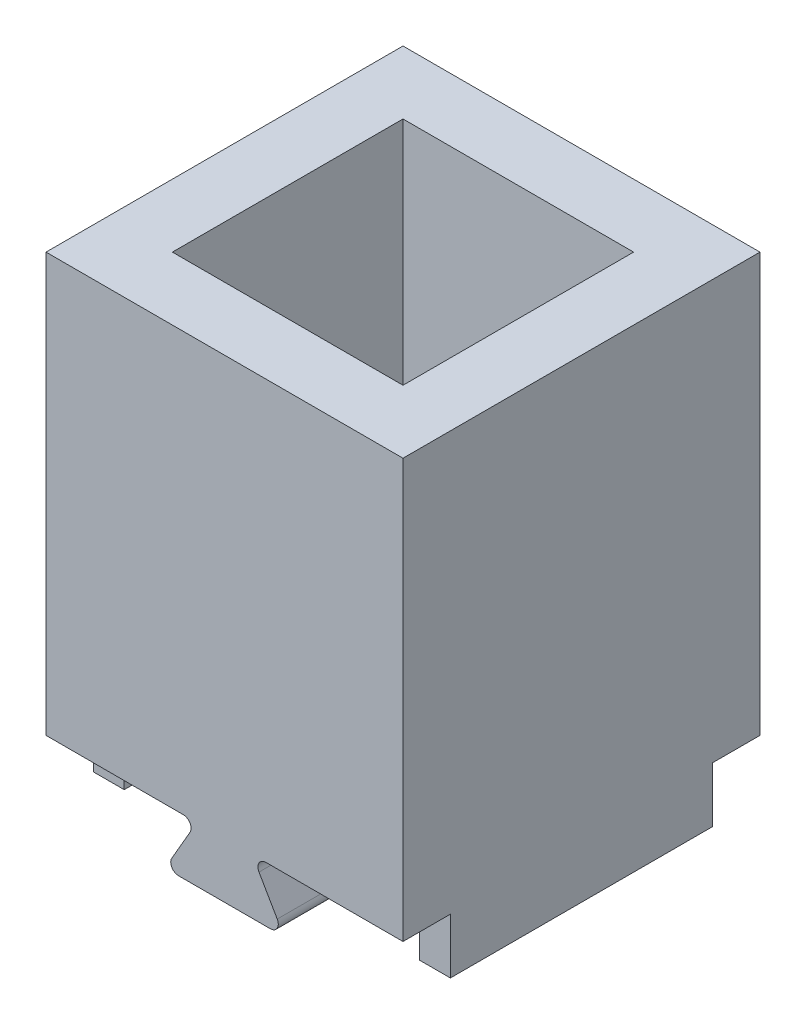
ISO-10303-21;
HEADER;
FILE_DESCRIPTION(('STEP AP214'),'2;1');
FILE_NAME('part.step','',(''),(''),'','','');
FILE_SCHEMA(('AUTOMOTIVE_DESIGN { 1 0 10303 214 1 1 1 1 }'));
ENDSEC;
DATA;
#1=APPLICATION_CONTEXT('core data for automotive mechanical design processes');
#2=APPLICATION_PROTOCOL_DEFINITION('international standard','automotive_design',2000,#1);
#3=PRODUCT_CONTEXT('',#1,'mechanical');
#4=PRODUCT('Part','Part','',(#3));
#5=PRODUCT_RELATED_PRODUCT_CATEGORY('part','',(#4));
#6=PRODUCT_DEFINITION_FORMATION('','',#4);
#7=PRODUCT_DEFINITION_CONTEXT('part definition',#1,'design');
#8=PRODUCT_DEFINITION('design','',#6,#7);
#9=PRODUCT_DEFINITION_SHAPE('','',#8);
#10=(LENGTH_UNIT() NAMED_UNIT(*) SI_UNIT(.MILLI.,.METRE.));
#11=(NAMED_UNIT(*) PLANE_ANGLE_UNIT() SI_UNIT($,.RADIAN.));
#12=(NAMED_UNIT(*) SI_UNIT($,.STERADIAN.) SOLID_ANGLE_UNIT());
#13=UNCERTAINTY_MEASURE_WITH_UNIT(LENGTH_MEASURE(1.E-05),#10,'distance_accuracy_value','');
#14=(GEOMETRIC_REPRESENTATION_CONTEXT(3) GLOBAL_UNCERTAINTY_ASSIGNED_CONTEXT((#13)) GLOBAL_UNIT_ASSIGNED_CONTEXT((#10,
#11,#12)) REPRESENTATION_CONTEXT('',''));
#15=CARTESIAN_POINT('',(0.,0.,0.));
#16=DIRECTION('',(0.,0.,1.));
#17=DIRECTION('',(1.,0.,0.));
#18=AXIS2_PLACEMENT_3D('',#15,#16,#17);
#19=CARTESIAN_POINT('',(-1.75,3.5,-11.3));
#20=DIRECTION('',(0.,1.,0.));
#21=DIRECTION('',(-1.,0.,0.));
#22=AXIS2_PLACEMENT_3D('',#19,#20,#21);
#23=PLANE('',#22);
#24=DIRECTION('',(-1.,0.,0.));
#25=VECTOR('',#24,1.);
#26=CARTESIAN_POINT('',(-9.35,3.5,8.3));
#27=LINE('',#26,#25);
#28=CARTESIAN_POINT('',(-9.35,3.5,8.3));
#29=VERTEX_POINT('',#28);
#30=CARTESIAN_POINT('',(-11.3,3.5,8.3));
#31=VERTEX_POINT('',#30);
#32=EDGE_CURVE('E47',#29,#31,#27,.T.);
#33=ORIENTED_EDGE('',*,*,#32,.F.);
#34=DIRECTION('',(0.,0.,1.));
#35=VECTOR('',#34,1.);
#36=CARTESIAN_POINT('',(-9.35,3.5,-8.3));
#37=LINE('',#36,#35);
#38=CARTESIAN_POINT('',(-9.35,3.5,-8.3));
#39=VERTEX_POINT('',#38);
#40=EDGE_CURVE('E260',#39,#29,#37,.T.);
#41=ORIENTED_EDGE('',*,*,#40,.F.);
#42=DIRECTION('',(1.,0.,0.));
#43=VECTOR('',#42,1.);
#44=CARTESIAN_POINT('',(-9.35,3.5,-8.3));
#45=LINE('',#44,#43);
#46=CARTESIAN_POINT('',(-11.3,3.5,-8.3));
#47=VERTEX_POINT('',#46);
#48=EDGE_CURVE('E257',#47,#39,#45,.T.);
#49=ORIENTED_EDGE('',*,*,#48,.F.);
#50=DIRECTION('',(0.,0.,1.));
#51=VECTOR('',#50,1.);
#52=CARTESIAN_POINT('',(-11.3,3.5,-11.3));
#53=LINE('',#52,#51);
#54=CARTESIAN_POINT('',(-11.3,3.5,-11.3));
#55=VERTEX_POINT('',#54);
#56=EDGE_CURVE('E308',#55,#47,#53,.T.);
#57=ORIENTED_EDGE('',*,*,#56,.F.);
#58=DIRECTION('',(-1.,0.,0.));
#59=VECTOR('',#58,1.);
#60=CARTESIAN_POINT('',(-1.75,3.5,-11.3));
#61=LINE('',#60,#59);
#62=CARTESIAN_POINT('',(-2.61602540378444,3.5,-11.3));
#63=VERTEX_POINT('',#62);
#64=EDGE_CURVE('E314',#63,#55,#61,.T.);
#65=ORIENTED_EDGE('',*,*,#64,.F.);
#66=DIRECTION('',(0.,0.,1.));
#67=VECTOR('',#66,1.);
#68=CARTESIAN_POINT('',(-2.61602540378444,3.5,-7.3));
#69=LINE('',#68,#67);
#70=CARTESIAN_POINT('',(-2.61602540378444,3.5,-7.3));
#71=VERTEX_POINT('',#70);
#72=EDGE_CURVE('E418',#63,#71,#69,.T.);
#73=ORIENTED_EDGE('',*,*,#72,.T.);
#74=DIRECTION('',(-1.,0.,0.));
#75=VECTOR('',#74,1.);
#76=CARTESIAN_POINT('',(-7.3,3.5,-7.3));
#77=LINE('',#76,#75);
#78=CARTESIAN_POINT('',(-7.3,3.5,-7.3));
#79=VERTEX_POINT('',#78);
#80=EDGE_CURVE('E329',#71,#79,#77,.T.);
#81=ORIENTED_EDGE('',*,*,#80,.T.);
#82=DIRECTION('',(0.,0.,1.));
#83=VECTOR('',#82,1.);
#84=CARTESIAN_POINT('',(-7.3,3.5,7.3));
#85=LINE('',#84,#83);
#86=CARTESIAN_POINT('',(-7.3,3.5,7.3));
#87=VERTEX_POINT('',#86);
#88=EDGE_CURVE('E327',#79,#87,#85,.T.);
#89=ORIENTED_EDGE('',*,*,#88,.T.);
#90=DIRECTION('',(1.,0.,0.));
#91=VECTOR('',#90,1.);
#92=CARTESIAN_POINT('',(-7.3,3.5,7.3));
#93=LINE('',#92,#91);
#94=CARTESIAN_POINT('',(-2.61602540378444,3.5,7.3));
#95=VERTEX_POINT('',#94);
#96=EDGE_CURVE('E396',#87,#95,#93,.T.);
#97=ORIENTED_EDGE('',*,*,#96,.T.);
#98=DIRECTION('',(0.,0.,1.));
#99=VECTOR('',#98,1.);
#100=CARTESIAN_POINT('',(-2.61602540378444,3.5,11.3));
#101=LINE('',#100,#99);
#102=CARTESIAN_POINT('',(-2.61602540378444,3.5,11.3));
#103=VERTEX_POINT('',#102);
#104=EDGE_CURVE('E421',#95,#103,#101,.T.);
#105=ORIENTED_EDGE('',*,*,#104,.T.);
#106=DIRECTION('',(-1.,0.,0.));
#107=VECTOR('',#106,1.);
#108=CARTESIAN_POINT('',(-1.75,3.5,11.3));
#109=LINE('',#108,#107);
#110=CARTESIAN_POINT('',(-11.3,3.5,11.3));
#111=VERTEX_POINT('',#110);
#112=EDGE_CURVE('E296',#103,#111,#109,.T.);
#113=ORIENTED_EDGE('',*,*,#112,.T.);
#114=EDGE_CURVE('E52',#31,#111,#53,.T.);
#115=ORIENTED_EDGE('',*,*,#114,.F.);
#116=EDGE_LOOP('',(#33,#41,#49,#57,#65,#73,#81,#89,#97,#105,#113,#115));
#117=FACE_BOUND('',#116,.T.);
#118=ADVANCED_FACE('F32',(#117),#23,.F.);
#119=CARTESIAN_POINT('',(1.75,3.5,-11.3));
#120=DIRECTION('',(0.,1.,0.));
#121=DIRECTION('',(-1.,0.,0.));
#122=AXIS2_PLACEMENT_3D('',#119,#120,#121);
#123=PLANE('',#122);
#124=DIRECTION('',(-1.,0.,0.));
#125=VECTOR('',#124,1.);
#126=CARTESIAN_POINT('',(11.3,3.5,8.3));
#127=LINE('',#126,#125);
#128=CARTESIAN_POINT('',(11.3,3.5,8.3));
#129=VERTEX_POINT('',#128);
#130=CARTESIAN_POINT('',(9.35,3.5,8.3));
#131=VERTEX_POINT('',#130);
#132=EDGE_CURVE('E261',#129,#131,#127,.T.);
#133=ORIENTED_EDGE('',*,*,#132,.F.);
#134=DIRECTION('',(0.,0.,1.));
#135=VECTOR('',#134,1.);
#136=CARTESIAN_POINT('',(11.3,3.5,-11.3));
#137=LINE('',#136,#135);
#138=CARTESIAN_POINT('',(11.3,3.5,11.3));
#139=VERTEX_POINT('',#138);
#140=EDGE_CURVE('E304',#129,#139,#137,.T.);
#141=ORIENTED_EDGE('',*,*,#140,.T.);
#142=DIRECTION('',(-1.,0.,0.));
#143=VECTOR('',#142,1.);
#144=CARTESIAN_POINT('',(1.75,3.5,11.3));
#145=LINE('',#144,#143);
#146=CARTESIAN_POINT('',(2.61602540378444,3.5,11.3));
#147=VERTEX_POINT('',#146);
#148=EDGE_CURVE('E305',#139,#147,#145,.T.);
#149=ORIENTED_EDGE('',*,*,#148,.T.);
#150=DIRECTION('',(0.,0.,1.));
#151=VECTOR('',#150,1.);
#152=CARTESIAN_POINT('',(2.61602540378444,3.5,7.3));
#153=LINE('',#152,#151);
#154=CARTESIAN_POINT('',(2.61602540378444,3.5,7.3));
#155=VERTEX_POINT('',#154);
#156=EDGE_CURVE('E409',#147,#155,#153,.F.);
#157=ORIENTED_EDGE('',*,*,#156,.T.);
#158=DIRECTION('',(1.,0.,0.));
#159=VECTOR('',#158,1.);
#160=CARTESIAN_POINT('',(-7.3,3.5,7.3));
#161=LINE('',#160,#159);
#162=CARTESIAN_POINT('',(7.3,3.5,7.3));
#163=VERTEX_POINT('',#162);
#164=EDGE_CURVE('E399',#155,#163,#161,.T.);
#165=ORIENTED_EDGE('',*,*,#164,.T.);
#166=DIRECTION('',(0.,0.,-1.));
#167=VECTOR('',#166,1.);
#168=CARTESIAN_POINT('',(7.3,3.5,7.3));
#169=LINE('',#168,#167);
#170=CARTESIAN_POINT('',(7.3,3.5,-7.3));
#171=VERTEX_POINT('',#170);
#172=EDGE_CURVE('E331',#163,#171,#169,.T.);
#173=ORIENTED_EDGE('',*,*,#172,.T.);
#174=DIRECTION('',(-1.,0.,0.));
#175=VECTOR('',#174,1.);
#176=CARTESIAN_POINT('',(-7.3,3.5,-7.3));
#177=LINE('',#176,#175);
#178=CARTESIAN_POINT('',(2.61602540378444,3.5,-7.3));
#179=VERTEX_POINT('',#178);
#180=EDGE_CURVE('E333',#171,#179,#177,.T.);
#181=ORIENTED_EDGE('',*,*,#180,.T.);
#182=DIRECTION('',(0.,0.,1.));
#183=VECTOR('',#182,1.);
#184=CARTESIAN_POINT('',(2.61602540378444,3.5,-11.3));
#185=LINE('',#184,#183);
#186=CARTESIAN_POINT('',(2.61602540378444,3.5,-11.3));
#187=VERTEX_POINT('',#186);
#188=EDGE_CURVE('E411',#179,#187,#185,.F.);
#189=ORIENTED_EDGE('',*,*,#188,.T.);
#190=DIRECTION('',(-1.,0.,0.));
#191=VECTOR('',#190,1.);
#192=CARTESIAN_POINT('',(1.75,3.5,-11.3));
#193=LINE('',#192,#191);
#194=CARTESIAN_POINT('',(11.3,3.5,-11.3));
#195=VERTEX_POINT('',#194);
#196=EDGE_CURVE('E297',#195,#187,#193,.T.);
#197=ORIENTED_EDGE('',*,*,#196,.F.);
#198=CARTESIAN_POINT('',(11.3,3.5,-8.3));
#199=VERTEX_POINT('',#198);
#200=EDGE_CURVE('E311',#195,#199,#137,.T.);
#201=ORIENTED_EDGE('',*,*,#200,.T.);
#202=DIRECTION('',(1.,0.,0.));
#203=VECTOR('',#202,1.);
#204=CARTESIAN_POINT('',(11.3,3.5,-8.3));
#205=LINE('',#204,#203);
#206=CARTESIAN_POINT('',(9.35,3.5,-8.3));
#207=VERTEX_POINT('',#206);
#208=EDGE_CURVE('E274',#207,#199,#205,.T.);
#209=ORIENTED_EDGE('',*,*,#208,.F.);
#210=DIRECTION('',(0.,0.,-1.));
#211=VECTOR('',#210,1.);
#212=CARTESIAN_POINT('',(9.35,3.5,-8.3));
#213=LINE('',#212,#211);
#214=EDGE_CURVE('E264',#131,#207,#213,.T.);
#215=ORIENTED_EDGE('',*,*,#214,.F.);
#216=EDGE_LOOP('',(#133,#141,#149,#157,#165,#173,#181,#189,#197,#201,#209,#215));
#217=FACE_BOUND('',#216,.T.);
#218=ADVANCED_FACE('F510',(#217),#123,.F.);
#219=CARTESIAN_POINT('',(0.,0.,0.));
#220=DIRECTION('',(0.,-1.,0.));
#221=DIRECTION('',(0.,0.,-1.));
#222=AXIS2_PLACEMENT_3D('',#219,#220,#221);
#223=PLANE('',#222);
#224=DIRECTION('',(1.,0.,0.));
#225=VECTOR('',#224,1.);
#226=CARTESIAN_POINT('',(-7.3,0.,7.3));
#227=LINE('',#226,#225);
#228=CARTESIAN_POINT('',(-2.90470053837927,0.,7.3));
#229=VERTEX_POINT('',#228);
#230=CARTESIAN_POINT('',(2.90470053837927,0.,7.3));
#231=VERTEX_POINT('',#230);
#232=EDGE_CURVE('E343',#229,#231,#227,.T.);
#233=ORIENTED_EDGE('',*,*,#232,.T.);
#234=DIRECTION('',(0.,0.,1.));
#235=VECTOR('',#234,1.);
#236=CARTESIAN_POINT('',(2.90470053837927,0.,11.3));
#237=LINE('',#236,#235);
#238=CARTESIAN_POINT('',(2.90470053837927,0.,11.3));
#239=VERTEX_POINT('',#238);
#240=EDGE_CURVE('E449',#231,#239,#237,.T.);
#241=ORIENTED_EDGE('',*,*,#240,.T.);
#242=DIRECTION('',(1.,0.,0.));
#243=VECTOR('',#242,1.);
#244=CARTESIAN_POINT('',(-11.3,0.,11.3));
#245=LINE('',#244,#243);
#246=CARTESIAN_POINT('',(-2.90470053837927,0.,11.3));
#247=VERTEX_POINT('',#246);
#248=EDGE_CURVE('E371',#247,#239,#245,.T.);
#249=ORIENTED_EDGE('',*,*,#248,.F.);
#250=DIRECTION('',(0.,0.,1.));
#251=VECTOR('',#250,1.);
#252=CARTESIAN_POINT('',(-2.90470053837927,0.,7.3));
#253=LINE('',#252,#251);
#254=EDGE_CURVE('E447',#247,#229,#253,.F.);
#255=ORIENTED_EDGE('',*,*,#254,.T.);
#256=EDGE_LOOP('',(#233,#241,#249,#255));
#257=FACE_BOUND('',#256,.T.);
#258=ADVANCED_FACE('F546',(#257),#223,.T.);
#259=CARTESIAN_POINT('',(0.,30.,0.));
#260=DIRECTION('',(0.,-1.,0.));
#261=DIRECTION('',(0.,0.,-1.));
#262=AXIS2_PLACEMENT_3D('',#259,#260,#261);
#263=PLANE('',#262);
#264=DIRECTION('',(0.,0.,-1.));
#265=VECTOR('',#264,1.);
#266=CARTESIAN_POINT('',(11.3,30.,11.3));
#267=LINE('',#266,#265);
#268=CARTESIAN_POINT('',(11.3,30.,11.3));
#269=VERTEX_POINT('',#268);
#270=CARTESIAN_POINT('',(11.3,30.,-11.3));
#271=VERTEX_POINT('',#270);
#272=EDGE_CURVE('E367',#269,#271,#267,.T.);
#273=ORIENTED_EDGE('',*,*,#272,.T.);
#274=DIRECTION('',(-1.,0.,0.));
#275=VECTOR('',#274,1.);
#276=CARTESIAN_POINT('',(-11.3,30.,-11.3));
#277=LINE('',#276,#275);
#278=CARTESIAN_POINT('',(-11.3,30.,-11.3));
#279=VERTEX_POINT('',#278);
#280=EDGE_CURVE('E370',#271,#279,#277,.T.);
#281=ORIENTED_EDGE('',*,*,#280,.T.);
#282=DIRECTION('',(0.,0.,1.));
#283=VECTOR('',#282,1.);
#284=CARTESIAN_POINT('',(-11.3,30.,11.3));
#285=LINE('',#284,#283);
#286=CARTESIAN_POINT('',(-11.3,30.,11.3));
#287=VERTEX_POINT('',#286);
#288=EDGE_CURVE('E373',#279,#287,#285,.T.);
#289=ORIENTED_EDGE('',*,*,#288,.T.);
#290=DIRECTION('',(1.,0.,0.));
#291=VECTOR('',#290,1.);
#292=CARTESIAN_POINT('',(-11.3,30.,11.3));
#293=LINE('',#292,#291);
#294=EDGE_CURVE('E375',#287,#269,#293,.T.);
#295=ORIENTED_EDGE('',*,*,#294,.T.);
#296=EDGE_LOOP('',(#273,#281,#289,#295));
#297=FACE_BOUND('',#296,.T.);
#298=DIRECTION('',(0.,0.,-1.));
#299=VECTOR('',#298,1.);
#300=CARTESIAN_POINT('',(7.3,30.,7.3));
#301=LINE('',#300,#299);
#302=CARTESIAN_POINT('',(7.3,30.,7.3));
#303=VERTEX_POINT('',#302);
#304=CARTESIAN_POINT('',(7.3,30.,-7.3));
#305=VERTEX_POINT('',#304);
#306=EDGE_CURVE('E340',#303,#305,#301,.T.);
#307=ORIENTED_EDGE('',*,*,#306,.F.);
#308=DIRECTION('',(1.,0.,0.));
#309=VECTOR('',#308,1.);
#310=CARTESIAN_POINT('',(-7.3,30.,7.3));
#311=LINE('',#310,#309);
#312=CARTESIAN_POINT('',(-7.3,30.,7.3));
#313=VERTEX_POINT('',#312);
#314=EDGE_CURVE('E348',#313,#303,#311,.T.);
#315=ORIENTED_EDGE('',*,*,#314,.F.);
#316=DIRECTION('',(0.,0.,1.));
#317=VECTOR('',#316,1.);
#318=CARTESIAN_POINT('',(-7.3,30.,7.3));
#319=LINE('',#318,#317);
#320=CARTESIAN_POINT('',(-7.3,30.,-7.3));
#321=VERTEX_POINT('',#320);
#322=EDGE_CURVE('E345',#321,#313,#319,.T.);
#323=ORIENTED_EDGE('',*,*,#322,.F.);
#324=DIRECTION('',(-1.,0.,0.));
#325=VECTOR('',#324,1.);
#326=CARTESIAN_POINT('',(-7.3,30.,-7.3));
#327=LINE('',#326,#325);
#328=EDGE_CURVE('E342',#305,#321,#327,.T.);
#329=ORIENTED_EDGE('',*,*,#328,.F.);
#330=EDGE_LOOP('',(#307,#315,#323,#329));
#331=FACE_BOUND('',#330,.T.);
#332=ADVANCED_FACE('F500',(#297,#331),#263,.F.);
#333=DIRECTION('',(-1.,0.,0.));
#334=VECTOR('',#333,1.);
#335=CARTESIAN_POINT('',(-11.3,0.,-11.3));
#336=LINE('',#335,#334);
#337=CARTESIAN_POINT('',(2.90470053837927,0.,-11.3));
#338=VERTEX_POINT('',#337);
#339=CARTESIAN_POINT('',(-2.90470053837927,0.,-11.3));
#340=VERTEX_POINT('',#339);
#341=EDGE_CURVE('E366',#338,#340,#336,.T.);
#342=ORIENTED_EDGE('',*,*,#341,.F.);
#343=DIRECTION('',(0.,0.,1.));
#344=VECTOR('',#343,1.);
#345=CARTESIAN_POINT('',(2.90470053837927,0.,-7.3));
#346=LINE('',#345,#344);
#347=CARTESIAN_POINT('',(2.90470053837927,0.,-7.3));
#348=VERTEX_POINT('',#347);
#349=EDGE_CURVE('E436',#338,#348,#346,.T.);
#350=ORIENTED_EDGE('',*,*,#349,.T.);
#351=DIRECTION('',(-1.,0.,0.));
#352=VECTOR('',#351,1.);
#353=CARTESIAN_POINT('',(-7.3,0.,-7.3));
#354=LINE('',#353,#352);
#355=CARTESIAN_POINT('',(-2.90470053837927,0.,-7.3));
#356=VERTEX_POINT('',#355);
#357=EDGE_CURVE('E339',#348,#356,#354,.T.);
#358=ORIENTED_EDGE('',*,*,#357,.T.);
#359=DIRECTION('',(0.,0.,1.));
#360=VECTOR('',#359,1.);
#361=CARTESIAN_POINT('',(-2.90470053837927,0.,-11.3));
#362=LINE('',#361,#360);
#363=EDGE_CURVE('E434',#356,#340,#362,.F.);
#364=ORIENTED_EDGE('',*,*,#363,.T.);
#365=EDGE_LOOP('',(#342,#350,#358,#364));
#366=FACE_BOUND('',#365,.T.);
#367=ADVANCED_FACE('F601',(#366),#223,.T.);
#368=CARTESIAN_POINT('',(11.3,30.,11.3));
#369=DIRECTION('',(-1.,0.,0.));
#370=DIRECTION('',(0.,0.,1.));
#371=AXIS2_PLACEMENT_3D('',#368,#369,#370);
#372=PLANE('',#371);
#373=DIRECTION('',(0.,-1.,0.));
#374=VECTOR('',#373,1.);
#375=CARTESIAN_POINT('',(11.3,30.,11.3));
#376=LINE('',#375,#374);
#377=EDGE_CURVE('E377',#269,#139,#376,.T.);
#378=ORIENTED_EDGE('',*,*,#377,.T.);
#379=ORIENTED_EDGE('',*,*,#140,.F.);
#380=DIRECTION('',(0.,1.,0.));
#381=VECTOR('',#380,1.);
#382=CARTESIAN_POINT('',(11.3,0.,8.3));
#383=LINE('',#382,#381);
#384=CARTESIAN_POINT('',(11.3,0.,8.3));
#385=VERTEX_POINT('',#384);
#386=EDGE_CURVE('E293',#385,#129,#383,.T.);
#387=ORIENTED_EDGE('',*,*,#386,.F.);
#388=DIRECTION('',(0.,0.,1.));
#389=VECTOR('',#388,1.);
#390=CARTESIAN_POINT('',(11.3,0.,-8.3));
#391=LINE('',#390,#389);
#392=CARTESIAN_POINT('',(11.3,0.,-8.3));
#393=VERTEX_POINT('',#392);
#394=EDGE_CURVE('E270',#393,#385,#391,.T.);
#395=ORIENTED_EDGE('',*,*,#394,.F.);
#396=DIRECTION('',(0.,1.,0.));
#397=VECTOR('',#396,1.);
#398=CARTESIAN_POINT('',(11.3,0.,-8.3));
#399=LINE('',#398,#397);
#400=EDGE_CURVE('E279',#393,#199,#399,.T.);
#401=ORIENTED_EDGE('',*,*,#400,.T.);
#402=ORIENTED_EDGE('',*,*,#200,.F.);
#403=DIRECTION('',(0.,-1.,0.));
#404=VECTOR('',#403,1.);
#405=CARTESIAN_POINT('',(11.3,30.,-11.3));
#406=LINE('',#405,#404);
#407=EDGE_CURVE('E390',#271,#195,#406,.T.);
#408=ORIENTED_EDGE('',*,*,#407,.F.);
#409=ORIENTED_EDGE('',*,*,#272,.F.);
#410=EDGE_LOOP('',(#378,#379,#387,#395,#401,#402,#408,#409));
#411=FACE_BOUND('',#410,.T.);
#412=ADVANCED_FACE('F506',(#411),#372,.F.);
#413=CARTESIAN_POINT('',(-11.3,30.,-11.3));
#414=DIRECTION('',(0.,0.,1.));
#415=DIRECTION('',(1.,0.,0.));
#416=AXIS2_PLACEMENT_3D('',#413,#414,#415);
#417=PLANE('',#416);
#418=DIRECTION('',(0.500000000000004,-0.866025403784436,0.));
#419=VECTOR('',#418,1.);
#420=CARTESIAN_POINT('',(3.77072594216371,0.,-11.3));
#421=LINE('',#420,#419);
#422=CARTESIAN_POINT('',(2.18301270189223,2.75,-11.3));
#423=VERTEX_POINT('',#422);
#424=CARTESIAN_POINT('',(3.33771324027149,0.750000000000002,-11.3));
#425=VERTEX_POINT('',#424);
#426=EDGE_CURVE('E300',#423,#425,#421,.T.);
#427=ORIENTED_EDGE('',*,*,#426,.T.);
#428=CARTESIAN_POINT('',(2.90470053837927,0.5,-11.3));
#429=DIRECTION('',(0.,0.,1.));
#430=DIRECTION('',(1.,0.,0.));
#431=AXIS2_PLACEMENT_3D('',#428,#429,#430);
#432=CIRCLE('',#431,0.5);
#433=EDGE_CURVE('E445',#425,#338,#432,.F.);
#434=ORIENTED_EDGE('',*,*,#433,.T.);
#435=ORIENTED_EDGE('',*,*,#341,.T.);
#436=CARTESIAN_POINT('',(-2.90470053837927,0.5,-11.3));
#437=DIRECTION('',(0.,0.,1.));
#438=DIRECTION('',(1.,0.,0.));
#439=AXIS2_PLACEMENT_3D('',#436,#437,#438);
#440=CIRCLE('',#439,0.5);
#441=CARTESIAN_POINT('',(-3.33771324027149,0.750000000000002,-11.3));
#442=VERTEX_POINT('',#441);
#443=EDGE_CURVE('E443',#340,#442,#440,.F.);
#444=ORIENTED_EDGE('',*,*,#443,.T.);
#445=DIRECTION('',(0.500000000000004,0.866025403784436,0.));
#446=VECTOR('',#445,1.);
#447=CARTESIAN_POINT('',(-3.77072594216371,0.,-11.3));
#448=LINE('',#447,#446);
#449=CARTESIAN_POINT('',(-2.18301270189223,2.75,-11.3));
#450=VERTEX_POINT('',#449);
#451=EDGE_CURVE('E316',#442,#450,#448,.T.);
#452=ORIENTED_EDGE('',*,*,#451,.T.);
#453=CARTESIAN_POINT('',(-2.61602540378444,3.,-11.3));
#454=DIRECTION('',(0.,0.,1.));
#455=DIRECTION('',(1.,0.,0.));
#456=AXIS2_PLACEMENT_3D('',#453,#454,#455);
#457=CIRCLE('',#456,0.5);
#458=EDGE_CURVE('E11',#450,#63,#457,.T.);
#459=ORIENTED_EDGE('',*,*,#458,.T.);
#460=ORIENTED_EDGE('',*,*,#64,.T.);
#461=DIRECTION('',(0.,-1.,0.));
#462=VECTOR('',#461,1.);
#463=CARTESIAN_POINT('',(-11.3,30.,-11.3));
#464=LINE('',#463,#462);
#465=EDGE_CURVE('E387',#279,#55,#464,.T.);
#466=ORIENTED_EDGE('',*,*,#465,.F.);
#467=ORIENTED_EDGE('',*,*,#280,.F.);
#468=ORIENTED_EDGE('',*,*,#407,.T.);
#469=ORIENTED_EDGE('',*,*,#196,.T.);
#470=CARTESIAN_POINT('',(2.61602540378444,3.,-11.3));
#471=DIRECTION('',(0.,0.,1.));
#472=DIRECTION('',(1.,0.,0.));
#473=AXIS2_PLACEMENT_3D('',#470,#471,#472);
#474=CIRCLE('',#473,0.5);
#475=EDGE_CURVE('E462',#187,#423,#474,.T.);
#476=ORIENTED_EDGE('',*,*,#475,.T.);
#477=EDGE_LOOP('',(#427,#434,#435,#444,#452,#459,#460,#466,#467,#468,#469,#476));
#478=FACE_BOUND('',#477,.T.);
#479=ADVANCED_FACE('F487',(#478),#417,.F.);
#480=CARTESIAN_POINT('',(-11.3,30.,11.3));
#481=DIRECTION('',(1.,0.,0.));
#482=DIRECTION('',(0.,0.,-1.));
#483=AXIS2_PLACEMENT_3D('',#480,#481,#482);
#484=PLANE('',#483);
#485=ORIENTED_EDGE('',*,*,#465,.T.);
#486=ORIENTED_EDGE('',*,*,#56,.T.);
#487=DIRECTION('',(0.,1.,0.));
#488=VECTOR('',#487,1.);
#489=CARTESIAN_POINT('',(-11.3,0.,-8.3));
#490=LINE('',#489,#488);
#491=CARTESIAN_POINT('',(-11.3,0.,-8.3));
#492=VERTEX_POINT('',#491);
#493=EDGE_CURVE('E266',#492,#47,#490,.T.);
#494=ORIENTED_EDGE('',*,*,#493,.F.);
#495=DIRECTION('',(0.,0.,-1.));
#496=VECTOR('',#495,1.);
#497=CARTESIAN_POINT('',(-11.3,0.,-8.3));
#498=LINE('',#497,#496);
#499=CARTESIAN_POINT('',(-11.3,0.,8.3));
#500=VERTEX_POINT('',#499);
#501=EDGE_CURVE('E247',#500,#492,#498,.T.);
#502=ORIENTED_EDGE('',*,*,#501,.F.);
#503=DIRECTION('',(0.,1.,0.));
#504=VECTOR('',#503,1.);
#505=CARTESIAN_POINT('',(-11.3,0.,8.3));
#506=LINE('',#505,#504);
#507=EDGE_CURVE('E244',#500,#31,#506,.T.);
#508=ORIENTED_EDGE('',*,*,#507,.T.);
#509=ORIENTED_EDGE('',*,*,#114,.T.);
#510=DIRECTION('',(0.,-1.,0.));
#511=VECTOR('',#510,1.);
#512=CARTESIAN_POINT('',(-11.3,30.,11.3));
#513=LINE('',#512,#511);
#514=EDGE_CURVE('E384',#287,#111,#513,.T.);
#515=ORIENTED_EDGE('',*,*,#514,.F.);
#516=ORIENTED_EDGE('',*,*,#288,.F.);
#517=EDGE_LOOP('',(#485,#486,#494,#502,#508,#509,#515,#516));
#518=FACE_BOUND('',#517,.T.);
#519=ADVANCED_FACE('F495',(#518),#484,.F.);
#520=CARTESIAN_POINT('',(-11.3,30.,11.3));
#521=DIRECTION('',(0.,0.,-1.));
#522=DIRECTION('',(-1.,0.,0.));
#523=AXIS2_PLACEMENT_3D('',#520,#521,#522);
#524=PLANE('',#523);
#525=ORIENTED_EDGE('',*,*,#248,.T.);
#526=CARTESIAN_POINT('',(2.90470053837927,0.5,11.3));
#527=DIRECTION('',(0.,0.,-1.));
#528=DIRECTION('',(-1.,0.,0.));
#529=AXIS2_PLACEMENT_3D('',#526,#527,#528);
#530=CIRCLE('',#529,0.5);
#531=CARTESIAN_POINT('',(3.33771324027149,0.750000000000002,11.3));
#532=VERTEX_POINT('',#531);
#533=EDGE_CURVE('E454',#239,#532,#530,.F.);
#534=ORIENTED_EDGE('',*,*,#533,.T.);
#535=DIRECTION('',(0.500000000000004,-0.866025403784436,0.));
#536=VECTOR('',#535,1.);
#537=CARTESIAN_POINT('',(3.77072594216371,0.,11.3));
#538=LINE('',#537,#536);
#539=CARTESIAN_POINT('',(2.18301270189223,2.75,11.3));
#540=VERTEX_POINT('',#539);
#541=EDGE_CURVE('E301',#540,#532,#538,.T.);
#542=ORIENTED_EDGE('',*,*,#541,.F.);
#543=CARTESIAN_POINT('',(2.61602540378444,3.,11.3));
#544=DIRECTION('',(0.,0.,-1.));
#545=DIRECTION('',(-1.,0.,0.));
#546=AXIS2_PLACEMENT_3D('',#543,#544,#545);
#547=CIRCLE('',#546,0.5);
#548=EDGE_CURVE('E464',#540,#147,#547,.T.);
#549=ORIENTED_EDGE('',*,*,#548,.T.);
#550=ORIENTED_EDGE('',*,*,#148,.F.);
#551=ORIENTED_EDGE('',*,*,#377,.F.);
#552=ORIENTED_EDGE('',*,*,#294,.F.);
#553=ORIENTED_EDGE('',*,*,#514,.T.);
#554=ORIENTED_EDGE('',*,*,#112,.F.);
#555=CARTESIAN_POINT('',(-2.61602540378444,3.,11.3));
#556=DIRECTION('',(0.,0.,-1.));
#557=DIRECTION('',(-1.,0.,0.));
#558=AXIS2_PLACEMENT_3D('',#555,#556,#557);
#559=CIRCLE('',#558,0.5);
#560=CARTESIAN_POINT('',(-2.18301270189223,2.75,11.3));
#561=VERTEX_POINT('',#560);
#562=EDGE_CURVE('E468',#103,#561,#559,.T.);
#563=ORIENTED_EDGE('',*,*,#562,.T.);
#564=DIRECTION('',(0.500000000000004,0.866025403784436,0.));
#565=VECTOR('',#564,1.);
#566=CARTESIAN_POINT('',(-3.77072594216371,0.,11.3));
#567=LINE('',#566,#565);
#568=CARTESIAN_POINT('',(-3.33771324027149,0.750000000000002,11.3));
#569=VERTEX_POINT('',#568);
#570=EDGE_CURVE('E317',#569,#561,#567,.T.);
#571=ORIENTED_EDGE('',*,*,#570,.F.);
#572=CARTESIAN_POINT('',(-2.90470053837927,0.5,11.3));
#573=DIRECTION('',(0.,0.,-1.));
#574=DIRECTION('',(-1.,0.,0.));
#575=AXIS2_PLACEMENT_3D('',#572,#573,#574);
#576=CIRCLE('',#575,0.5);
#577=EDGE_CURVE('E452',#569,#247,#576,.F.);
#578=ORIENTED_EDGE('',*,*,#577,.T.);
#579=EDGE_LOOP('',(#525,#534,#542,#549,#550,#551,#552,#553,#554,#563,#571,#578));
#580=FACE_BOUND('',#579,.T.);
#581=ADVANCED_FACE('F526',(#580),#524,.F.);
#582=CARTESIAN_POINT('',(7.3,30.,7.3));
#583=DIRECTION('',(-1.,0.,0.));
#584=DIRECTION('',(0.,0.,1.));
#585=AXIS2_PLACEMENT_3D('',#582,#583,#584);
#586=PLANE('',#585);
#587=ORIENTED_EDGE('',*,*,#172,.F.);
#588=DIRECTION('',(0.,-1.,0.));
#589=VECTOR('',#588,1.);
#590=CARTESIAN_POINT('',(7.3,30.,7.3));
#591=LINE('',#590,#589);
#592=EDGE_CURVE('E350',#303,#163,#591,.T.);
#593=ORIENTED_EDGE('',*,*,#592,.F.);
#594=ORIENTED_EDGE('',*,*,#306,.T.);
#595=DIRECTION('',(0.,-1.,0.));
#596=VECTOR('',#595,1.);
#597=CARTESIAN_POINT('',(7.3,30.,-7.3));
#598=LINE('',#597,#596);
#599=EDGE_CURVE('E363',#305,#171,#598,.T.);
#600=ORIENTED_EDGE('',*,*,#599,.T.);
#601=EDGE_LOOP('',(#587,#593,#594,#600));
#602=FACE_BOUND('',#601,.T.);
#603=ADVANCED_FACE('F595',(#602),#586,.T.);
#604=CARTESIAN_POINT('',(-7.3,30.,-7.3));
#605=DIRECTION('',(0.,0.,1.));
#606=DIRECTION('',(1.,0.,0.));
#607=AXIS2_PLACEMENT_3D('',#604,#605,#606);
#608=PLANE('',#607);
#609=ORIENTED_EDGE('',*,*,#357,.F.);
#610=CARTESIAN_POINT('',(2.90470053837927,0.5,-7.3));
#611=DIRECTION('',(0.,0.,1.));
#612=DIRECTION('',(1.,0.,0.));
#613=AXIS2_PLACEMENT_3D('',#610,#611,#612);
#614=CIRCLE('',#613,0.5);
#615=CARTESIAN_POINT('',(3.33771324027149,0.750000000000001,-7.3));
#616=VERTEX_POINT('',#615);
#617=EDGE_CURVE('E441',#348,#616,#614,.T.);
#618=ORIENTED_EDGE('',*,*,#617,.T.);
#619=DIRECTION('',(0.500000000000004,-0.866025403784436,0.));
#620=VECTOR('',#619,1.);
#621=CARTESIAN_POINT('',(-11.9873366001439,27.2937649521245,-7.3));
#622=LINE('',#621,#620);
#623=CARTESIAN_POINT('',(2.18301270189222,2.75,-7.3));
#624=VERTEX_POINT('',#623);
#625=EDGE_CURVE('E336',#624,#616,#622,.T.);
#626=ORIENTED_EDGE('',*,*,#625,.F.);
#627=CARTESIAN_POINT('',(2.61602540378444,3.,-7.3));
#628=DIRECTION('',(0.,0.,1.));
#629=DIRECTION('',(1.,0.,0.));
#630=AXIS2_PLACEMENT_3D('',#627,#628,#629);
#631=CIRCLE('',#630,0.5);
#632=EDGE_CURVE('E460',#624,#179,#631,.F.);
#633=ORIENTED_EDGE('',*,*,#632,.T.);
#634=ORIENTED_EDGE('',*,*,#180,.F.);
#635=ORIENTED_EDGE('',*,*,#599,.F.);
#636=ORIENTED_EDGE('',*,*,#328,.T.);
#637=DIRECTION('',(0.,-1.,0.));
#638=VECTOR('',#637,1.);
#639=CARTESIAN_POINT('',(-7.3,30.,-7.3));
#640=LINE('',#639,#638);
#641=EDGE_CURVE('E360',#321,#79,#640,.T.);
#642=ORIENTED_EDGE('',*,*,#641,.T.);
#643=ORIENTED_EDGE('',*,*,#80,.F.);
#644=CARTESIAN_POINT('',(-2.61602540378444,3.,-7.3));
#645=DIRECTION('',(0.,0.,1.));
#646=DIRECTION('',(1.,0.,0.));
#647=AXIS2_PLACEMENT_3D('',#644,#645,#646);
#648=CIRCLE('',#647,0.5);
#649=CARTESIAN_POINT('',(-2.18301270189223,2.74999999999999,-7.3));
#650=VERTEX_POINT('',#649);
#651=EDGE_CURVE('E40',#71,#650,#648,.F.);
#652=ORIENTED_EDGE('',*,*,#651,.T.);
#653=DIRECTION('',(0.500000000000005,0.866025403784436,0.));
#654=VECTOR('',#653,1.);
#655=CARTESIAN_POINT('',(8.33733660014386,20.9717795044981,-7.3));
#656=LINE('',#655,#654);
#657=CARTESIAN_POINT('',(-3.33771324027149,0.749999999999997,-7.3));
#658=VERTEX_POINT('',#657);
#659=EDGE_CURVE('E313',#658,#650,#656,.T.);
#660=ORIENTED_EDGE('',*,*,#659,.F.);
#661=CARTESIAN_POINT('',(-2.90470053837927,0.5,-7.3));
#662=DIRECTION('',(0.,0.,1.));
#663=DIRECTION('',(1.,0.,0.));
#664=AXIS2_PLACEMENT_3D('',#661,#662,#663);
#665=CIRCLE('',#664,0.5);
#666=EDGE_CURVE('E439',#658,#356,#665,.T.);
#667=ORIENTED_EDGE('',*,*,#666,.T.);
#668=EDGE_LOOP('',(#609,#618,#626,#633,#634,#635,#636,#642,#643,#652,#660,#667));
#669=FACE_BOUND('',#668,.T.);
#670=ADVANCED_FACE('F475',(#669),#608,.T.);
#671=CARTESIAN_POINT('',(-7.3,30.,7.3));
#672=DIRECTION('',(1.,0.,0.));
#673=DIRECTION('',(0.,0.,-1.));
#674=AXIS2_PLACEMENT_3D('',#671,#672,#673);
#675=PLANE('',#674);
#676=ORIENTED_EDGE('',*,*,#88,.F.);
#677=ORIENTED_EDGE('',*,*,#641,.F.);
#678=ORIENTED_EDGE('',*,*,#322,.T.);
#679=DIRECTION('',(0.,-1.,0.));
#680=VECTOR('',#679,1.);
#681=CARTESIAN_POINT('',(-7.3,30.,7.3));
#682=LINE('',#681,#680);
#683=EDGE_CURVE('E357',#313,#87,#682,.T.);
#684=ORIENTED_EDGE('',*,*,#683,.T.);
#685=EDGE_LOOP('',(#676,#677,#678,#684));
#686=FACE_BOUND('',#685,.T.);
#687=ADVANCED_FACE('F589',(#686),#675,.T.);
#688=CARTESIAN_POINT('',(-7.3,30.,7.3));
#689=DIRECTION('',(0.,0.,-1.));
#690=DIRECTION('',(-1.,0.,0.));
#691=AXIS2_PLACEMENT_3D('',#688,#689,#690);
#692=PLANE('',#691);
#693=DIRECTION('',(-0.500000000000004,0.866025403784436,0.));
#694=VECTOR('',#693,1.);
#695=CARTESIAN_POINT('',(-11.9873366001439,27.2937649521245,7.3));
#696=LINE('',#695,#694);
#697=CARTESIAN_POINT('',(3.33771324027149,0.750000000000001,7.3));
#698=VERTEX_POINT('',#697);
#699=CARTESIAN_POINT('',(2.18301270189222,2.75,7.3));
#700=VERTEX_POINT('',#699);
#701=EDGE_CURVE('E401',#698,#700,#696,.T.);
#702=ORIENTED_EDGE('',*,*,#701,.F.);
#703=CARTESIAN_POINT('',(2.90470053837927,0.5,7.3));
#704=DIRECTION('',(0.,0.,-1.));
#705=DIRECTION('',(-1.,0.,0.));
#706=AXIS2_PLACEMENT_3D('',#703,#704,#705);
#707=CIRCLE('',#706,0.5);
#708=EDGE_CURVE('E458',#698,#231,#707,.T.);
#709=ORIENTED_EDGE('',*,*,#708,.T.);
#710=ORIENTED_EDGE('',*,*,#232,.F.);
#711=CARTESIAN_POINT('',(-2.90470053837927,0.5,7.3));
#712=DIRECTION('',(0.,0.,-1.));
#713=DIRECTION('',(-1.,0.,0.));
#714=AXIS2_PLACEMENT_3D('',#711,#712,#713);
#715=CIRCLE('',#714,0.5);
#716=CARTESIAN_POINT('',(-3.33771324027149,0.749999999999997,7.3));
#717=VERTEX_POINT('',#716);
#718=EDGE_CURVE('E456',#229,#717,#715,.T.);
#719=ORIENTED_EDGE('',*,*,#718,.T.);
#720=DIRECTION('',(-0.500000000000005,-0.866025403784436,0.));
#721=VECTOR('',#720,1.);
#722=CARTESIAN_POINT('',(8.33733660014386,20.9717795044981,7.3));
#723=LINE('',#722,#721);
#724=CARTESIAN_POINT('',(-2.18301270189223,2.74999999999999,7.3));
#725=VERTEX_POINT('',#724);
#726=EDGE_CURVE('E393',#725,#717,#723,.T.);
#727=ORIENTED_EDGE('',*,*,#726,.F.);
#728=CARTESIAN_POINT('',(-2.61602540378444,3.,7.3));
#729=DIRECTION('',(0.,0.,-1.));
#730=DIRECTION('',(-1.,0.,0.));
#731=AXIS2_PLACEMENT_3D('',#728,#729,#730);
#732=CIRCLE('',#731,0.5);
#733=EDGE_CURVE('E470',#725,#95,#732,.F.);
#734=ORIENTED_EDGE('',*,*,#733,.T.);
#735=ORIENTED_EDGE('',*,*,#96,.F.);
#736=ORIENTED_EDGE('',*,*,#683,.F.);
#737=ORIENTED_EDGE('',*,*,#314,.T.);
#738=ORIENTED_EDGE('',*,*,#592,.T.);
#739=ORIENTED_EDGE('',*,*,#164,.F.);
#740=CARTESIAN_POINT('',(2.61602540378444,3.,7.3));
#741=DIRECTION('',(0.,0.,-1.));
#742=DIRECTION('',(-1.,0.,0.));
#743=AXIS2_PLACEMENT_3D('',#740,#741,#742);
#744=CIRCLE('',#743,0.5);
#745=EDGE_CURVE('E466',#155,#700,#744,.F.);
#746=ORIENTED_EDGE('',*,*,#745,.T.);
#747=EDGE_LOOP('',(#702,#709,#710,#719,#727,#734,#735,#736,#737,#738,#739,#746));
#748=FACE_BOUND('',#747,.T.);
#749=ADVANCED_FACE('F538',(#748),#692,.T.);
#750=CARTESIAN_POINT('',(-3.77072594216371,0.,-11.3));
#751=DIRECTION('',(0.866025403784436,-0.500000000000004,0.));
#752=DIRECTION('',(0.500000000000005,0.866025403784436,0.));
#753=AXIS2_PLACEMENT_3D('',#750,#751,#752);
#754=PLANE('',#753);
#755=ORIENTED_EDGE('',*,*,#659,.T.);
#756=DIRECTION('',(0.,0.,1.));
#757=VECTOR('',#756,1.);
#758=CARTESIAN_POINT('',(-2.18301270189223,2.75,-11.3));
#759=LINE('',#758,#757);
#760=EDGE_CURVE('E432',#650,#450,#759,.F.);
#761=ORIENTED_EDGE('',*,*,#760,.T.);
#762=ORIENTED_EDGE('',*,*,#451,.F.);
#763=DIRECTION('',(0.,0.,1.));
#764=VECTOR('',#763,1.);
#765=CARTESIAN_POINT('',(-3.33771324027149,0.750000000000002,-7.3));
#766=LINE('',#765,#764);
#767=EDGE_CURVE('E429',#442,#658,#766,.T.);
#768=ORIENTED_EDGE('',*,*,#767,.T.);
#769=EDGE_LOOP('',(#755,#761,#762,#768));
#770=FACE_BOUND('',#769,.T.);
#771=ADVANCED_FACE('F480',(#770),#754,.F.);
#772=ORIENTED_EDGE('',*,*,#570,.T.);
#773=DIRECTION('',(0.,0.,1.));
#774=VECTOR('',#773,1.);
#775=CARTESIAN_POINT('',(-2.18301270189223,2.75,7.3));
#776=LINE('',#775,#774);
#777=EDGE_CURVE('E427',#561,#725,#776,.F.);
#778=ORIENTED_EDGE('',*,*,#777,.T.);
#779=ORIENTED_EDGE('',*,*,#726,.T.);
#780=DIRECTION('',(0.,0.,1.));
#781=VECTOR('',#780,1.);
#782=CARTESIAN_POINT('',(-3.33771324027149,0.750000000000002,11.3));
#783=LINE('',#782,#781);
#784=EDGE_CURVE('E424',#717,#569,#783,.T.);
#785=ORIENTED_EDGE('',*,*,#784,.T.);
#786=EDGE_LOOP('',(#772,#778,#779,#785));
#787=FACE_BOUND('',#786,.T.);
#788=ADVANCED_FACE('F553',(#787),#754,.F.);
#789=CARTESIAN_POINT('',(3.77072594216371,0.,-11.3));
#790=DIRECTION('',(-0.866025403784436,-0.500000000000004,0.));
#791=DIRECTION('',(0.500000000000004,-0.866025403784436,0.));
#792=AXIS2_PLACEMENT_3D('',#789,#790,#791);
#793=PLANE('',#792);
#794=ORIENTED_EDGE('',*,*,#426,.F.);
#795=DIRECTION('',(0.,0.,1.));
#796=VECTOR('',#795,1.);
#797=CARTESIAN_POINT('',(2.18301270189223,2.75,-7.3));
#798=LINE('',#797,#796);
#799=EDGE_CURVE('E406',#423,#624,#798,.T.);
#800=ORIENTED_EDGE('',*,*,#799,.T.);
#801=ORIENTED_EDGE('',*,*,#625,.T.);
#802=DIRECTION('',(0.,0.,1.));
#803=VECTOR('',#802,1.);
#804=CARTESIAN_POINT('',(3.33771324027149,0.750000000000002,-11.3));
#805=LINE('',#804,#803);
#806=EDGE_CURVE('E404',#616,#425,#805,.F.);
#807=ORIENTED_EDGE('',*,*,#806,.T.);
#808=EDGE_LOOP('',(#794,#800,#801,#807));
#809=FACE_BOUND('',#808,.T.);
#810=ADVANCED_FACE('F643',(#809),#793,.F.);
#811=ORIENTED_EDGE('',*,*,#701,.T.);
#812=DIRECTION('',(0.,0.,1.));
#813=VECTOR('',#812,1.);
#814=CARTESIAN_POINT('',(2.18301270189223,2.75,11.3));
#815=LINE('',#814,#813);
#816=EDGE_CURVE('E415',#700,#540,#815,.T.);
#817=ORIENTED_EDGE('',*,*,#816,.T.);
#818=ORIENTED_EDGE('',*,*,#541,.T.);
#819=DIRECTION('',(0.,0.,1.));
#820=VECTOR('',#819,1.);
#821=CARTESIAN_POINT('',(3.33771324027149,0.750000000000002,7.3));
#822=LINE('',#821,#820);
#823=EDGE_CURVE('E413',#532,#698,#822,.F.);
#824=ORIENTED_EDGE('',*,*,#823,.T.);
#825=EDGE_LOOP('',(#811,#817,#818,#824));
#826=FACE_BOUND('',#825,.T.);
#827=ADVANCED_FACE('F533',(#826),#793,.F.);
#828=CARTESIAN_POINT('',(2.61602540378444,3.,-11.3));
#829=DIRECTION('',(0.,0.,-1.));
#830=DIRECTION('',(-1.,0.,0.));
#831=AXIS2_PLACEMENT_3D('',#828,#829,#830);
#832=CYLINDRICAL_SURFACE('',#831,0.5);
#833=ORIENTED_EDGE('',*,*,#475,.F.);
#834=ORIENTED_EDGE('',*,*,#188,.F.);
#835=ORIENTED_EDGE('',*,*,#632,.F.);
#836=ORIENTED_EDGE('',*,*,#799,.F.);
#837=EDGE_LOOP('',(#833,#834,#835,#836));
#838=FACE_BOUND('',#837,.T.);
#839=ADVANCED_FACE('F613',(#838),#832,.F.);
#840=CARTESIAN_POINT('',(2.61602540378444,3.,-11.3));
#841=DIRECTION('',(0.,0.,-1.));
#842=DIRECTION('',(-1.,0.,0.));
#843=AXIS2_PLACEMENT_3D('',#840,#841,#842);
#844=CYLINDRICAL_SURFACE('',#843,0.5);
#845=ORIENTED_EDGE('',*,*,#745,.F.);
#846=ORIENTED_EDGE('',*,*,#156,.F.);
#847=ORIENTED_EDGE('',*,*,#548,.F.);
#848=ORIENTED_EDGE('',*,*,#816,.F.);
#849=EDGE_LOOP('',(#845,#846,#847,#848));
#850=FACE_BOUND('',#849,.T.);
#851=ADVANCED_FACE('F531',(#850),#844,.F.);
#852=CARTESIAN_POINT('',(-2.61602540378444,3.,-11.3));
#853=DIRECTION('',(0.,0.,-1.));
#854=DIRECTION('',(-1.,0.,0.));
#855=AXIS2_PLACEMENT_3D('',#852,#853,#854);
#856=CYLINDRICAL_SURFACE('',#855,0.5);
#857=ORIENTED_EDGE('',*,*,#733,.F.);
#858=ORIENTED_EDGE('',*,*,#777,.F.);
#859=ORIENTED_EDGE('',*,*,#562,.F.);
#860=ORIENTED_EDGE('',*,*,#104,.F.);
#861=EDGE_LOOP('',(#857,#858,#859,#860));
#862=FACE_BOUND('',#861,.T.);
#863=ADVANCED_FACE('F560',(#862),#856,.F.);
#864=CARTESIAN_POINT('',(-2.61602540378444,3.,-11.3));
#865=DIRECTION('',(0.,0.,-1.));
#866=DIRECTION('',(-1.,0.,0.));
#867=AXIS2_PLACEMENT_3D('',#864,#865,#866);
#868=CYLINDRICAL_SURFACE('',#867,0.5);
#869=ORIENTED_EDGE('',*,*,#458,.F.);
#870=ORIENTED_EDGE('',*,*,#760,.F.);
#871=ORIENTED_EDGE('',*,*,#651,.F.);
#872=ORIENTED_EDGE('',*,*,#72,.F.);
#873=EDGE_LOOP('',(#869,#870,#871,#872));
#874=FACE_BOUND('',#873,.T.);
#875=ADVANCED_FACE('F484',(#874),#868,.F.);
#876=CARTESIAN_POINT('',(2.90470053837927,0.5,0.));
#877=DIRECTION('',(0.,0.,-1.));
#878=DIRECTION('',(-1.,0.,0.));
#879=AXIS2_PLACEMENT_3D('',#876,#877,#878);
#880=CYLINDRICAL_SURFACE('',#879,0.5);
#881=ORIENTED_EDGE('',*,*,#433,.F.);
#882=ORIENTED_EDGE('',*,*,#806,.F.);
#883=ORIENTED_EDGE('',*,*,#617,.F.);
#884=ORIENTED_EDGE('',*,*,#349,.F.);
#885=EDGE_LOOP('',(#881,#882,#883,#884));
#886=FACE_BOUND('',#885,.T.);
#887=ADVANCED_FACE('F623',(#886),#880,.T.);
#888=CARTESIAN_POINT('',(2.90470053837927,0.5,0.));
#889=DIRECTION('',(0.,0.,-1.));
#890=DIRECTION('',(-1.,0.,0.));
#891=AXIS2_PLACEMENT_3D('',#888,#889,#890);
#892=CYLINDRICAL_SURFACE('',#891,0.5);
#893=ORIENTED_EDGE('',*,*,#708,.F.);
#894=ORIENTED_EDGE('',*,*,#823,.F.);
#895=ORIENTED_EDGE('',*,*,#533,.F.);
#896=ORIENTED_EDGE('',*,*,#240,.F.);
#897=EDGE_LOOP('',(#893,#894,#895,#896));
#898=FACE_BOUND('',#897,.T.);
#899=ADVANCED_FACE('F543',(#898),#892,.T.);
#900=CARTESIAN_POINT('',(-2.90470053837927,0.5,-11.3));
#901=DIRECTION('',(0.,0.,-1.));
#902=DIRECTION('',(-1.,0.,0.));
#903=AXIS2_PLACEMENT_3D('',#900,#901,#902);
#904=CYLINDRICAL_SURFACE('',#903,0.5);
#905=ORIENTED_EDGE('',*,*,#443,.F.);
#906=ORIENTED_EDGE('',*,*,#363,.F.);
#907=ORIENTED_EDGE('',*,*,#666,.F.);
#908=ORIENTED_EDGE('',*,*,#767,.F.);
#909=EDGE_LOOP('',(#905,#906,#907,#908));
#910=FACE_BOUND('',#909,.T.);
#911=ADVANCED_FACE('F628',(#910),#904,.T.);
#912=CARTESIAN_POINT('',(-2.90470053837927,0.5,-11.3));
#913=DIRECTION('',(0.,0.,-1.));
#914=DIRECTION('',(-1.,0.,0.));
#915=AXIS2_PLACEMENT_3D('',#912,#913,#914);
#916=CYLINDRICAL_SURFACE('',#915,0.5);
#917=ORIENTED_EDGE('',*,*,#718,.F.);
#918=ORIENTED_EDGE('',*,*,#254,.F.);
#919=ORIENTED_EDGE('',*,*,#577,.F.);
#920=ORIENTED_EDGE('',*,*,#784,.F.);
#921=EDGE_LOOP('',(#917,#918,#919,#920));
#922=FACE_BOUND('',#921,.T.);
#923=ADVANCED_FACE('F34',(#922),#916,.T.);
#924=CARTESIAN_POINT('',(11.3,0.,8.3));
#925=DIRECTION('',(0.,0.,-1.));
#926=DIRECTION('',(-1.,0.,0.));
#927=AXIS2_PLACEMENT_3D('',#924,#925,#926);
#928=PLANE('',#927);
#929=ORIENTED_EDGE('',*,*,#132,.T.);
#930=DIRECTION('',(0.,1.,0.));
#931=VECTOR('',#930,1.);
#932=CARTESIAN_POINT('',(9.35,0.,8.3));
#933=LINE('',#932,#931);
#934=CARTESIAN_POINT('',(9.35,0.,8.3));
#935=VERTEX_POINT('',#934);
#936=EDGE_CURVE('E290',#935,#131,#933,.T.);
#937=ORIENTED_EDGE('',*,*,#936,.F.);
#938=DIRECTION('',(-1.,0.,0.));
#939=VECTOR('',#938,1.);
#940=CARTESIAN_POINT('',(11.3,0.,8.3));
#941=LINE('',#940,#939);
#942=EDGE_CURVE('E273',#385,#935,#941,.T.);
#943=ORIENTED_EDGE('',*,*,#942,.F.);
#944=ORIENTED_EDGE('',*,*,#386,.T.);
#945=EDGE_LOOP('',(#929,#937,#943,#944));
#946=FACE_BOUND('',#945,.T.);
#947=ADVANCED_FACE('F521',(#946),#928,.F.);
#948=CARTESIAN_POINT('',(9.35,0.,-8.3));
#949=DIRECTION('',(1.,0.,0.));
#950=DIRECTION('',(0.,1.,0.));
#951=AXIS2_PLACEMENT_3D('',#948,#949,#950);
#952=PLANE('',#951);
#953=ORIENTED_EDGE('',*,*,#214,.T.);
#954=DIRECTION('',(0.,1.,0.));
#955=VECTOR('',#954,1.);
#956=CARTESIAN_POINT('',(9.35,0.,-8.3));
#957=LINE('',#956,#955);
#958=CARTESIAN_POINT('',(9.35,0.,-8.3));
#959=VERTEX_POINT('',#958);
#960=EDGE_CURVE('E287',#959,#207,#957,.T.);
#961=ORIENTED_EDGE('',*,*,#960,.F.);
#962=DIRECTION('',(0.,0.,-1.));
#963=VECTOR('',#962,1.);
#964=CARTESIAN_POINT('',(9.35,0.,-8.3));
#965=LINE('',#964,#963);
#966=EDGE_CURVE('E276',#935,#959,#965,.T.);
#967=ORIENTED_EDGE('',*,*,#966,.F.);
#968=ORIENTED_EDGE('',*,*,#936,.T.);
#969=EDGE_LOOP('',(#953,#961,#967,#968));
#970=FACE_BOUND('',#969,.T.);
#971=ADVANCED_FACE('F517',(#970),#952,.F.);
#972=CARTESIAN_POINT('',(11.3,0.,-8.3));
#973=DIRECTION('',(0.,0.,1.));
#974=DIRECTION('',(1.,0.,0.));
#975=AXIS2_PLACEMENT_3D('',#972,#973,#974);
#976=PLANE('',#975);
#977=ORIENTED_EDGE('',*,*,#208,.T.);
#978=ORIENTED_EDGE('',*,*,#400,.F.);
#979=DIRECTION('',(1.,0.,0.));
#980=VECTOR('',#979,1.);
#981=CARTESIAN_POINT('',(11.3,0.,-8.3));
#982=LINE('',#981,#980);
#983=EDGE_CURVE('E278',#959,#393,#982,.T.);
#984=ORIENTED_EDGE('',*,*,#983,.F.);
#985=ORIENTED_EDGE('',*,*,#960,.T.);
#986=EDGE_LOOP('',(#977,#978,#984,#985));
#987=FACE_BOUND('',#986,.T.);
#988=ADVANCED_FACE('F512',(#987),#976,.F.);
#989=CARTESIAN_POINT('',(0.,0.,0.));
#990=DIRECTION('',(0.,-1.,0.));
#991=DIRECTION('',(0.,0.,-1.));
#992=AXIS2_PLACEMENT_3D('',#989,#990,#991);
#993=PLANE('',#992);
#994=ORIENTED_EDGE('',*,*,#394,.T.);
#995=ORIENTED_EDGE('',*,*,#942,.T.);
#996=ORIENTED_EDGE('',*,*,#966,.T.);
#997=ORIENTED_EDGE('',*,*,#983,.T.);
#998=EDGE_LOOP('',(#994,#995,#996,#997));
#999=FACE_BOUND('',#998,.T.);
#1000=ADVANCED_FACE('F670',(#999),#993,.T.);
#1001=CARTESIAN_POINT('',(-9.35,0.,-8.3));
#1002=DIRECTION('',(-1.,0.,0.));
#1003=DIRECTION('',(0.,-1.,0.));
#1004=AXIS2_PLACEMENT_3D('',#1001,#1002,#1003);
#1005=PLANE('',#1004);
#1006=ORIENTED_EDGE('',*,*,#40,.T.);
#1007=DIRECTION('',(0.,1.,0.));
#1008=VECTOR('',#1007,1.);
#1009=CARTESIAN_POINT('',(-9.35,0.,8.3));
#1010=LINE('',#1009,#1008);
#1011=CARTESIAN_POINT('',(-9.35,0.,8.3));
#1012=VERTEX_POINT('',#1011);
#1013=EDGE_CURVE('E241',#1012,#29,#1010,.T.);
#1014=ORIENTED_EDGE('',*,*,#1013,.F.);
#1015=DIRECTION('',(0.,0.,1.));
#1016=VECTOR('',#1015,1.);
#1017=CARTESIAN_POINT('',(-9.35,0.,-8.3));
#1018=LINE('',#1017,#1016);
#1019=CARTESIAN_POINT('',(-9.35,0.,-8.3));
#1020=VERTEX_POINT('',#1019);
#1021=EDGE_CURVE('E248',#1020,#1012,#1018,.T.);
#1022=ORIENTED_EDGE('',*,*,#1021,.F.);
#1023=DIRECTION('',(0.,1.,0.));
#1024=VECTOR('',#1023,1.);
#1025=CARTESIAN_POINT('',(-9.35,0.,-8.3));
#1026=LINE('',#1025,#1024);
#1027=EDGE_CURVE('E563',#1020,#39,#1026,.T.);
#1028=ORIENTED_EDGE('',*,*,#1027,.T.);
#1029=EDGE_LOOP('',(#1006,#1014,#1022,#1028));
#1030=FACE_BOUND('',#1029,.T.);
#1031=ADVANCED_FACE('F259',(#1030),#1005,.F.);
#1032=CARTESIAN_POINT('',(-9.35,0.,8.3));
#1033=DIRECTION('',(0.,0.,-1.));
#1034=DIRECTION('',(-1.,0.,0.));
#1035=AXIS2_PLACEMENT_3D('',#1032,#1033,#1034);
#1036=PLANE('',#1035);
#1037=ORIENTED_EDGE('',*,*,#32,.T.);
#1038=ORIENTED_EDGE('',*,*,#507,.F.);
#1039=DIRECTION('',(-1.,0.,0.));
#1040=VECTOR('',#1039,1.);
#1041=CARTESIAN_POINT('',(-9.35,0.,8.3));
#1042=LINE('',#1041,#1040);
#1043=EDGE_CURVE('E237',#1012,#500,#1042,.T.);
#1044=ORIENTED_EDGE('',*,*,#1043,.F.);
#1045=ORIENTED_EDGE('',*,*,#1013,.T.);
#1046=EDGE_LOOP('',(#1037,#1038,#1044,#1045));
#1047=FACE_BOUND('',#1046,.T.);
#1048=ADVANCED_FACE('F239',(#1047),#1036,.F.);
#1049=CARTESIAN_POINT('',(-9.35,0.,-8.3));
#1050=DIRECTION('',(0.,0.,1.));
#1051=DIRECTION('',(1.,0.,0.));
#1052=AXIS2_PLACEMENT_3D('',#1049,#1050,#1051);
#1053=PLANE('',#1052);
#1054=ORIENTED_EDGE('',*,*,#48,.T.);
#1055=ORIENTED_EDGE('',*,*,#1027,.F.);
#1056=DIRECTION('',(1.,0.,0.));
#1057=VECTOR('',#1056,1.);
#1058=CARTESIAN_POINT('',(-9.35,0.,-8.3));
#1059=LINE('',#1058,#1057);
#1060=EDGE_CURVE('E253',#492,#1020,#1059,.T.);
#1061=ORIENTED_EDGE('',*,*,#1060,.F.);
#1062=ORIENTED_EDGE('',*,*,#493,.T.);
#1063=EDGE_LOOP('',(#1054,#1055,#1061,#1062));
#1064=FACE_BOUND('',#1063,.T.);
#1065=ADVANCED_FACE('F570',(#1064),#1053,.F.);
#1066=CARTESIAN_POINT('',(0.,0.,0.));
#1067=DIRECTION('',(0.,-1.,0.));
#1068=DIRECTION('',(0.,0.,-1.));
#1069=AXIS2_PLACEMENT_3D('',#1066,#1067,#1068);
#1070=PLANE('',#1069);
#1071=ORIENTED_EDGE('',*,*,#1021,.T.);
#1072=ORIENTED_EDGE('',*,*,#1043,.T.);
#1073=ORIENTED_EDGE('',*,*,#501,.T.);
#1074=ORIENTED_EDGE('',*,*,#1060,.T.);
#1075=EDGE_LOOP('',(#1071,#1072,#1073,#1074));
#1076=FACE_BOUND('',#1075,.T.);
#1077=ADVANCED_FACE('F251',(#1076),#1070,.T.);
#1078=CLOSED_SHELL('',(#118,#218,#258,#332,#367,#412,#479,#519,#581,#603,#670,#687,#749,#771,
#788,#810,#827,#839,#851,#863,#875,#887,#899,#911,#923,#947,#971,#988,#1000,#1031,#1048,#1065,#1077));
#1079=MANIFOLD_SOLID_BREP('B2',#1078);
#1080=ADVANCED_BREP_SHAPE_REPRESENTATION('',(#18,#1079),#14);
#1081=SHAPE_DEFINITION_REPRESENTATION(#9,#1080);
ENDSEC;
END-ISO-10303-21;
